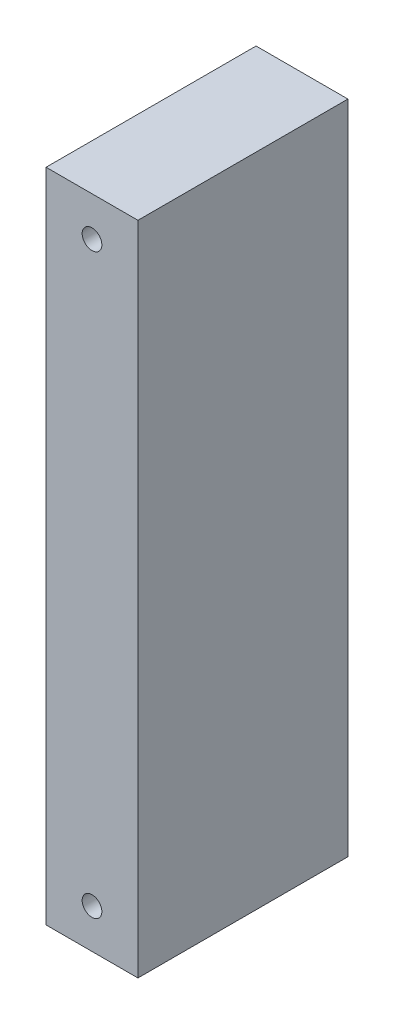
ISO-10303-21;
HEADER;
FILE_DESCRIPTION(('STEP AP214'),'2;1');
FILE_NAME('part.step','',(''),(''),'','','');
FILE_SCHEMA(('AUTOMOTIVE_DESIGN { 1 0 10303 214 1 1 1 1 }'));
ENDSEC;
DATA;
#1=APPLICATION_CONTEXT('core data for automotive mechanical design processes');
#2=APPLICATION_PROTOCOL_DEFINITION('international standard','automotive_design',2000,#1);
#3=PRODUCT_CONTEXT('',#1,'mechanical');
#4=PRODUCT('Part','Part','',(#3));
#5=PRODUCT_RELATED_PRODUCT_CATEGORY('part','',(#4));
#6=PRODUCT_DEFINITION_FORMATION('','',#4);
#7=PRODUCT_DEFINITION_CONTEXT('part definition',#1,'design');
#8=PRODUCT_DEFINITION('design','',#6,#7);
#9=PRODUCT_DEFINITION_SHAPE('','',#8);
#10=(LENGTH_UNIT() NAMED_UNIT(*) SI_UNIT(.MILLI.,.METRE.));
#11=(NAMED_UNIT(*) PLANE_ANGLE_UNIT() SI_UNIT($,.RADIAN.));
#12=(NAMED_UNIT(*) SI_UNIT($,.STERADIAN.) SOLID_ANGLE_UNIT());
#13=UNCERTAINTY_MEASURE_WITH_UNIT(LENGTH_MEASURE(1.E-05),#10,'distance_accuracy_value','');
#14=(GEOMETRIC_REPRESENTATION_CONTEXT(3) GLOBAL_UNCERTAINTY_ASSIGNED_CONTEXT((#13)) GLOBAL_UNIT_ASSIGNED_CONTEXT((#10,
#11,#12)) REPRESENTATION_CONTEXT('',''));
#15=CARTESIAN_POINT('',(0.,0.,0.));
#16=DIRECTION('',(0.,0.,1.));
#17=DIRECTION('',(1.,0.,0.));
#18=AXIS2_PLACEMENT_3D('',#15,#16,#17);
#19=CARTESIAN_POINT('',(0.,0.,14.));
#20=DIRECTION('',(0.,0.,-1.));
#21=DIRECTION('',(-1.,0.,0.));
#22=AXIS2_PLACEMENT_3D('',#19,#20,#21);
#23=PLANE('',#22);
#24=DIRECTION('',(0.,1.,0.));
#25=VECTOR('',#24,1.);
#26=CARTESIAN_POINT('',(3.5,-25.,14.));
#27=LINE('',#26,#25);
#28=CARTESIAN_POINT('',(3.5,-25.,14.));
#29=VERTEX_POINT('',#28);
#30=CARTESIAN_POINT('',(3.5,25.,14.));
#31=VERTEX_POINT('',#30);
#32=EDGE_CURVE('E88',#29,#31,#27,.T.);
#33=ORIENTED_EDGE('',*,*,#32,.T.);
#34=DIRECTION('',(-1.,0.,0.));
#35=VECTOR('',#34,1.);
#36=CARTESIAN_POINT('',(-3.5,25.,14.));
#37=LINE('',#36,#35);
#38=CARTESIAN_POINT('',(-3.5,25.,14.));
#39=VERTEX_POINT('',#38);
#40=EDGE_CURVE('E125',#31,#39,#37,.T.);
#41=ORIENTED_EDGE('',*,*,#40,.T.);
#42=DIRECTION('',(0.,-1.,0.));
#43=VECTOR('',#42,1.);
#44=CARTESIAN_POINT('',(-3.5,-25.,14.));
#45=LINE('',#44,#43);
#46=CARTESIAN_POINT('',(-3.5,-25.,14.));
#47=VERTEX_POINT('',#46);
#48=EDGE_CURVE('E63',#39,#47,#45,.T.);
#49=ORIENTED_EDGE('',*,*,#48,.T.);
#50=DIRECTION('',(1.,0.,0.));
#51=VECTOR('',#50,1.);
#52=CARTESIAN_POINT('',(-3.5,-25.,14.));
#53=LINE('',#52,#51);
#54=EDGE_CURVE('E58',#47,#29,#53,.T.);
#55=ORIENTED_EDGE('',*,*,#54,.T.);
#56=EDGE_LOOP('',(#33,#41,#49,#55));
#57=FACE_BOUND('',#56,.T.);
#58=CARTESIAN_POINT('',(0.,22.,14.));
#59=DIRECTION('',(0.,0.,1.));
#60=DIRECTION('',(1.,0.,0.));
#61=AXIS2_PLACEMENT_3D('',#58,#59,#60);
#62=CIRCLE('',#61,0.75);
#63=CARTESIAN_POINT('',(0.75,22.,14.));
#64=VERTEX_POINT('',#63);
#65=EDGE_CURVE('E119',#64,#64,#62,.T.);
#66=ORIENTED_EDGE('',*,*,#65,.F.);
#67=EDGE_LOOP('',(#66));
#68=FACE_BOUND('',#67,.T.);
#69=CARTESIAN_POINT('',(0.,-22.,14.));
#70=DIRECTION('',(0.,0.,1.));
#71=DIRECTION('',(1.,0.,0.));
#72=AXIS2_PLACEMENT_3D('',#69,#70,#71);
#73=CIRCLE('',#72,0.75);
#74=CARTESIAN_POINT('',(0.75,-22.,14.));
#75=VERTEX_POINT('',#74);
#76=EDGE_CURVE('E115',#75,#75,#73,.T.);
#77=ORIENTED_EDGE('',*,*,#76,.F.);
#78=EDGE_LOOP('',(#77));
#79=FACE_BOUND('',#78,.T.);
#80=ADVANCED_FACE('F42',(#57,#68,#79),#23,.F.);
#81=CARTESIAN_POINT('',(3.5,-25.,14.));
#82=DIRECTION('',(-1.,0.,0.));
#83=DIRECTION('',(0.,0.,1.));
#84=AXIS2_PLACEMENT_3D('',#81,#82,#83);
#85=PLANE('',#84);
#86=DIRECTION('',(0.,0.,-1.));
#87=VECTOR('',#86,1.);
#88=CARTESIAN_POINT('',(3.5,-25.,14.));
#89=LINE('',#88,#87);
#90=CARTESIAN_POINT('',(3.5,-25.,-2.));
#91=VERTEX_POINT('',#90);
#92=EDGE_CURVE('E83',#29,#91,#89,.T.);
#93=ORIENTED_EDGE('',*,*,#92,.T.);
#94=DIRECTION('',(0.,-1.,0.));
#95=VECTOR('',#94,1.);
#96=CARTESIAN_POINT('',(3.5,25.,-2.));
#97=LINE('',#96,#95);
#98=CARTESIAN_POINT('',(3.5,25.,-2.));
#99=VERTEX_POINT('',#98);
#100=EDGE_CURVE('E87',#99,#91,#97,.T.);
#101=ORIENTED_EDGE('',*,*,#100,.F.);
#102=DIRECTION('',(0.,0.,-1.));
#103=VECTOR('',#102,1.);
#104=CARTESIAN_POINT('',(3.5,25.,14.));
#105=LINE('',#104,#103);
#106=EDGE_CURVE('E11',#31,#99,#105,.T.);
#107=ORIENTED_EDGE('',*,*,#106,.F.);
#108=ORIENTED_EDGE('',*,*,#32,.F.);
#109=EDGE_LOOP('',(#93,#101,#107,#108));
#110=FACE_BOUND('',#109,.T.);
#111=ADVANCED_FACE('F44',(#110),#85,.F.);
#112=CARTESIAN_POINT('',(-3.5,25.,14.));
#113=DIRECTION('',(0.,-1.,0.));
#114=DIRECTION('',(0.,0.,-1.));
#115=AXIS2_PLACEMENT_3D('',#112,#113,#114);
#116=PLANE('',#115);
#117=ORIENTED_EDGE('',*,*,#106,.T.);
#118=DIRECTION('',(1.,0.,0.));
#119=VECTOR('',#118,1.);
#120=CARTESIAN_POINT('',(3.5,25.,-2.));
#121=LINE('',#120,#119);
#122=CARTESIAN_POINT('',(-3.5,25.,-2.));
#123=VERTEX_POINT('',#122);
#124=EDGE_CURVE('E105',#123,#99,#121,.T.);
#125=ORIENTED_EDGE('',*,*,#124,.F.);
#126=DIRECTION('',(0.,0.,-1.));
#127=VECTOR('',#126,1.);
#128=CARTESIAN_POINT('',(-3.5,25.,14.));
#129=LINE('',#128,#127);
#130=EDGE_CURVE('E51',#39,#123,#129,.T.);
#131=ORIENTED_EDGE('',*,*,#130,.F.);
#132=ORIENTED_EDGE('',*,*,#40,.F.);
#133=EDGE_LOOP('',(#117,#125,#131,#132));
#134=FACE_BOUND('',#133,.T.);
#135=ADVANCED_FACE('F138',(#134),#116,.F.);
#136=CARTESIAN_POINT('',(-3.5,-25.,14.));
#137=DIRECTION('',(1.,0.,0.));
#138=DIRECTION('',(0.,0.,-1.));
#139=AXIS2_PLACEMENT_3D('',#136,#137,#138);
#140=PLANE('',#139);
#141=ORIENTED_EDGE('',*,*,#130,.T.);
#142=DIRECTION('',(0.,1.,0.));
#143=VECTOR('',#142,1.);
#144=CARTESIAN_POINT('',(-3.5,25.,-2.));
#145=LINE('',#144,#143);
#146=CARTESIAN_POINT('',(-3.5,-25.,-2.));
#147=VERTEX_POINT('',#146);
#148=EDGE_CURVE('E99',#147,#123,#145,.T.);
#149=ORIENTED_EDGE('',*,*,#148,.F.);
#150=DIRECTION('',(0.,0.,-1.));
#151=VECTOR('',#150,1.);
#152=CARTESIAN_POINT('',(-3.5,-25.,14.));
#153=LINE('',#152,#151);
#154=EDGE_CURVE('E91',#47,#147,#153,.T.);
#155=ORIENTED_EDGE('',*,*,#154,.F.);
#156=ORIENTED_EDGE('',*,*,#48,.F.);
#157=EDGE_LOOP('',(#141,#149,#155,#156));
#158=FACE_BOUND('',#157,.T.);
#159=ADVANCED_FACE('F136',(#158),#140,.F.);
#160=CARTESIAN_POINT('',(-3.5,-25.,14.));
#161=DIRECTION('',(0.,1.,0.));
#162=DIRECTION('',(0.,0.,1.));
#163=AXIS2_PLACEMENT_3D('',#160,#161,#162);
#164=PLANE('',#163);
#165=ORIENTED_EDGE('',*,*,#154,.T.);
#166=DIRECTION('',(-1.,0.,0.));
#167=VECTOR('',#166,1.);
#168=CARTESIAN_POINT('',(3.5,-25.,-2.));
#169=LINE('',#168,#167);
#170=EDGE_CURVE('E94',#91,#147,#169,.T.);
#171=ORIENTED_EDGE('',*,*,#170,.F.);
#172=ORIENTED_EDGE('',*,*,#92,.F.);
#173=ORIENTED_EDGE('',*,*,#54,.F.);
#174=EDGE_LOOP('',(#165,#171,#172,#173));
#175=FACE_BOUND('',#174,.T.);
#176=ADVANCED_FACE('F95',(#175),#164,.F.);
#177=CARTESIAN_POINT('',(0.,22.,14.));
#178=DIRECTION('',(0.,0.,-1.));
#179=DIRECTION('',(-1.,0.,0.));
#180=AXIS2_PLACEMENT_3D('',#177,#178,#179);
#181=CYLINDRICAL_SURFACE('',#180,0.75);
#182=ORIENTED_EDGE('',*,*,#65,.T.);
#183=EDGE_LOOP('',(#182));
#184=FACE_BOUND('',#183,.T.);
#185=CARTESIAN_POINT('',(0.,22.,-2.));
#186=DIRECTION('',(0.,0.,-1.));
#187=DIRECTION('',(-1.,0.,0.));
#188=AXIS2_PLACEMENT_3D('',#185,#186,#187);
#189=CIRCLE('',#188,0.75);
#190=CARTESIAN_POINT('',(-0.75,22.,-2.));
#191=VERTEX_POINT('',#190);
#192=EDGE_CURVE('E106',#191,#191,#189,.T.);
#193=ORIENTED_EDGE('',*,*,#192,.T.);
#194=EDGE_LOOP('',(#193));
#195=FACE_BOUND('',#194,.T.);
#196=ADVANCED_FACE('F149',(#184,#195),#181,.F.);
#197=CARTESIAN_POINT('',(0.,-22.,14.));
#198=DIRECTION('',(0.,0.,-1.));
#199=DIRECTION('',(-1.,0.,0.));
#200=AXIS2_PLACEMENT_3D('',#197,#198,#199);
#201=CYLINDRICAL_SURFACE('',#200,0.75);
#202=ORIENTED_EDGE('',*,*,#76,.T.);
#203=EDGE_LOOP('',(#202));
#204=FACE_BOUND('',#203,.T.);
#205=CARTESIAN_POINT('',(0.,-22.,-2.));
#206=DIRECTION('',(0.,0.,-1.));
#207=DIRECTION('',(-1.,0.,0.));
#208=AXIS2_PLACEMENT_3D('',#205,#206,#207);
#209=CIRCLE('',#208,0.750000000000001);
#210=CARTESIAN_POINT('',(-0.750000000000001,-22.,-2.));
#211=VERTEX_POINT('',#210);
#212=EDGE_CURVE('E109',#211,#211,#209,.T.);
#213=ORIENTED_EDGE('',*,*,#212,.T.);
#214=EDGE_LOOP('',(#213));
#215=FACE_BOUND('',#214,.T.);
#216=ADVANCED_FACE('F146',(#204,#215),#201,.F.);
#217=CARTESIAN_POINT('',(0.,0.,-2.));
#218=DIRECTION('',(0.,0.,-1.));
#219=DIRECTION('',(-1.,0.,0.));
#220=AXIS2_PLACEMENT_3D('',#217,#218,#219);
#221=PLANE('',#220);
#222=ORIENTED_EDGE('',*,*,#192,.F.);
#223=EDGE_LOOP('',(#222));
#224=FACE_BOUND('',#223,.T.);
#225=ORIENTED_EDGE('',*,*,#100,.T.);
#226=ORIENTED_EDGE('',*,*,#170,.T.);
#227=ORIENTED_EDGE('',*,*,#148,.T.);
#228=ORIENTED_EDGE('',*,*,#124,.T.);
#229=EDGE_LOOP('',(#225,#226,#227,#228));
#230=FACE_BOUND('',#229,.T.);
#231=ORIENTED_EDGE('',*,*,#212,.F.);
#232=EDGE_LOOP('',(#231));
#233=FACE_BOUND('',#232,.T.);
#234=ADVANCED_FACE('F102',(#224,#230,#233),#221,.T.);
#235=CLOSED_SHELL('',(#80,#111,#135,#159,#176,#196,#216,#234));
#236=MANIFOLD_SOLID_BREP('B2',#235);
#237=ADVANCED_BREP_SHAPE_REPRESENTATION('',(#18,#236),#14);
#238=SHAPE_DEFINITION_REPRESENTATION(#9,#237);
ENDSEC;
END-ISO-10303-21;
